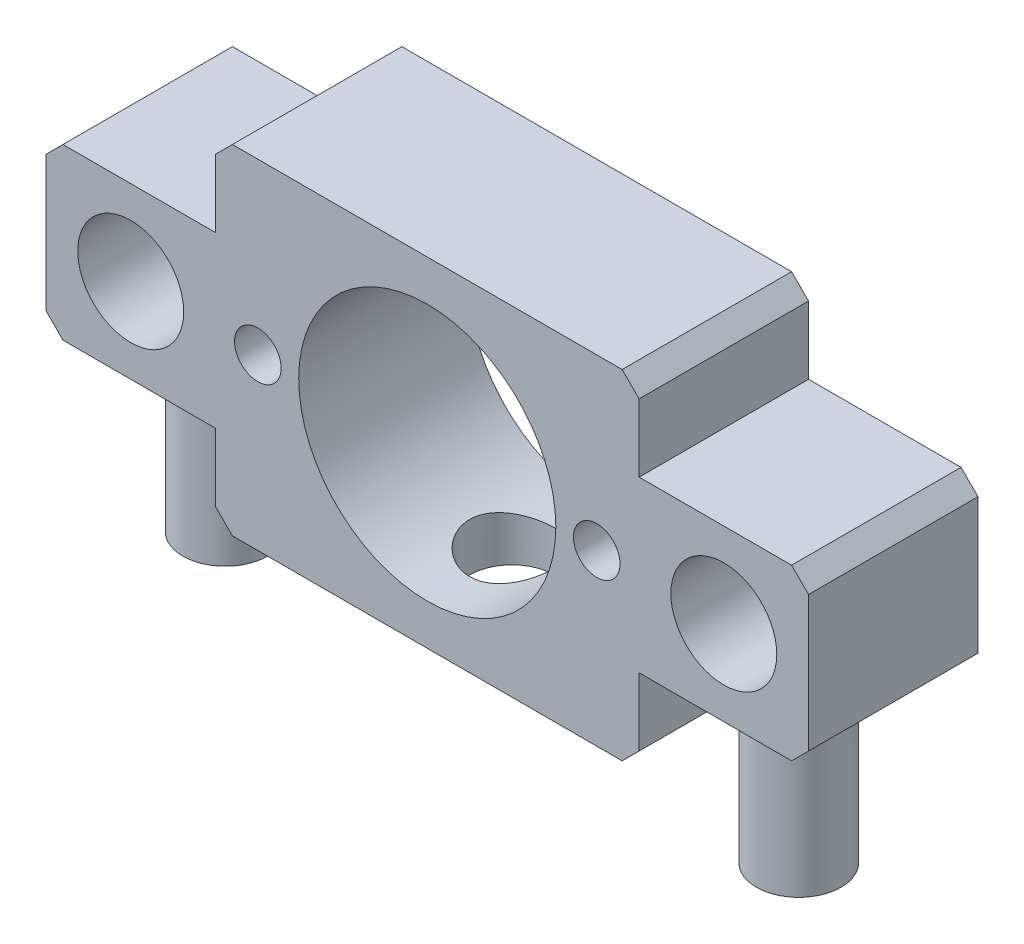
ISO-10303-21;
HEADER;
FILE_DESCRIPTION(('STEP AP214'),'2;1');
FILE_NAME('part.step','',(''),(''),'','','');
FILE_SCHEMA(('AUTOMOTIVE_DESIGN { 1 0 10303 214 1 1 1 1 }'));
ENDSEC;
DATA;
#1=APPLICATION_CONTEXT('core data for automotive mechanical design processes');
#2=APPLICATION_PROTOCOL_DEFINITION('international standard','automotive_design',2000,#1);
#3=PRODUCT_CONTEXT('',#1,'mechanical');
#4=PRODUCT('Part','Part','',(#3));
#5=PRODUCT_RELATED_PRODUCT_CATEGORY('part','',(#4));
#6=PRODUCT_DEFINITION_FORMATION('','',#4);
#7=PRODUCT_DEFINITION_CONTEXT('part definition',#1,'design');
#8=PRODUCT_DEFINITION('design','',#6,#7);
#9=PRODUCT_DEFINITION_SHAPE('','',#8);
#10=(LENGTH_UNIT() NAMED_UNIT(*) SI_UNIT(.MILLI.,.METRE.));
#11=(NAMED_UNIT(*) PLANE_ANGLE_UNIT() SI_UNIT($,.RADIAN.));
#12=(NAMED_UNIT(*) SI_UNIT($,.STERADIAN.) SOLID_ANGLE_UNIT());
#13=UNCERTAINTY_MEASURE_WITH_UNIT(LENGTH_MEASURE(1.E-05),#10,'distance_accuracy_value','');
#14=(GEOMETRIC_REPRESENTATION_CONTEXT(3) GLOBAL_UNCERTAINTY_ASSIGNED_CONTEXT((#13)) GLOBAL_UNIT_ASSIGNED_CONTEXT((#10,
#11,#12)) REPRESENTATION_CONTEXT('',''));
#15=CARTESIAN_POINT('',(0.,0.,0.));
#16=DIRECTION('',(0.,0.,1.));
#17=DIRECTION('',(1.,0.,0.));
#18=AXIS2_PLACEMENT_3D('',#15,#16,#17);
#19=CARTESIAN_POINT('',(0.,0.,10.));
#20=DIRECTION('',(0.,0.,1.));
#21=DIRECTION('',(1.,0.,0.));
#22=AXIS2_PLACEMENT_3D('',#19,#20,#21);
#23=PLANE('',#22);
#24=CARTESIAN_POINT('',(-20.,0.,10.));
#25=DIRECTION('',(0.,0.,1.));
#26=DIRECTION('',(1.,0.,0.));
#27=AXIS2_PLACEMENT_3D('',#24,#25,#26);
#28=CIRCLE('',#27,2.75);
#29=CARTESIAN_POINT('',(-17.25,0.,10.));
#30=VERTEX_POINT('',#29);
#31=EDGE_CURVE('E638',#30,#30,#28,.T.);
#32=ORIENTED_EDGE('',*,*,#31,.F.);
#33=EDGE_LOOP('',(#32));
#34=FACE_BOUND('',#33,.T.);
#35=CARTESIAN_POINT('',(20.,0.,10.));
#36=DIRECTION('',(0.,0.,1.));
#37=DIRECTION('',(-1.,0.,0.));
#38=AXIS2_PLACEMENT_3D('',#35,#36,#37);
#39=CIRCLE('',#38,2.75);
#40=CARTESIAN_POINT('',(17.25,0.,10.));
#41=VERTEX_POINT('',#40);
#42=EDGE_CURVE('E644',#41,#41,#39,.T.);
#43=ORIENTED_EDGE('',*,*,#42,.F.);
#44=EDGE_LOOP('',(#43));
#45=FACE_BOUND('',#44,.T.);
#46=CARTESIAN_POINT('',(0.,0.,10.));
#47=DIRECTION('',(0.,0.,1.));
#48=DIRECTION('',(1.,0.,0.));
#49=AXIS2_PLACEMENT_3D('',#46,#47,#48);
#50=CIRCLE('',#49,15.175);
#51=CARTESIAN_POINT('',(15.175,0.,10.));
#52=VERTEX_POINT('',#51);
#53=EDGE_CURVE('E422',#52,#52,#50,.T.);
#54=ORIENTED_EDGE('',*,*,#53,.F.);
#55=EDGE_LOOP('',(#54));
#56=FACE_BOUND('',#55,.T.);
#57=CARTESIAN_POINT('',(-35.,0.,10.));
#58=DIRECTION('',(0.,0.,1.));
#59=DIRECTION('',(1.,0.,0.));
#60=AXIS2_PLACEMENT_3D('',#57,#58,#59);
#61=CIRCLE('',#60,6.25);
#62=CARTESIAN_POINT('',(-28.75,0.,10.));
#63=VERTEX_POINT('',#62);
#64=EDGE_CURVE('E409',#63,#63,#61,.T.);
#65=ORIENTED_EDGE('',*,*,#64,.F.);
#66=EDGE_LOOP('',(#65));
#67=FACE_BOUND('',#66,.T.);
#68=CARTESIAN_POINT('',(35.,0.,10.));
#69=DIRECTION('',(0.,0.,1.));
#70=DIRECTION('',(-1.,0.,0.));
#71=AXIS2_PLACEMENT_3D('',#68,#69,#70);
#72=CIRCLE('',#71,6.25);
#73=CARTESIAN_POINT('',(28.75,0.,10.));
#74=VERTEX_POINT('',#73);
#75=EDGE_CURVE('E612',#74,#74,#72,.T.);
#76=ORIENTED_EDGE('',*,*,#75,.F.);
#77=EDGE_LOOP('',(#76));
#78=FACE_BOUND('',#77,.T.);
#79=DIRECTION('',(-1.,0.,0.));
#80=VECTOR('',#79,1.);
#81=CARTESIAN_POINT('',(45.,20.,10.));
#82=LINE('',#81,#80);
#83=CARTESIAN_POINT('',(23.,20.,10.));
#84=VERTEX_POINT('',#83);
#85=CARTESIAN_POINT('',(-23.,20.,10.));
#86=VERTEX_POINT('',#85);
#87=EDGE_CURVE('E296',#84,#86,#82,.T.);
#88=ORIENTED_EDGE('',*,*,#87,.T.);
#89=DIRECTION('',(-0.707106781186549,-0.707106781186546,0.));
#90=VECTOR('',#89,1.);
#91=CARTESIAN_POINT('',(-21.5,21.5,10.));
#92=LINE('',#91,#90);
#93=CARTESIAN_POINT('',(-25.,18.,10.));
#94=VERTEX_POINT('',#93);
#95=EDGE_CURVE('E359',#86,#94,#92,.T.);
#96=ORIENTED_EDGE('',*,*,#95,.T.);
#97=DIRECTION('',(0.,-1.,0.));
#98=VECTOR('',#97,1.);
#99=CARTESIAN_POINT('',(-25.,20.,10.));
#100=LINE('',#99,#98);
#101=CARTESIAN_POINT('',(-25.,10.,10.));
#102=VERTEX_POINT('',#101);
#103=EDGE_CURVE('E259',#94,#102,#100,.T.);
#104=ORIENTED_EDGE('',*,*,#103,.T.);
#105=DIRECTION('',(-1.,0.,0.));
#106=VECTOR('',#105,1.);
#107=CARTESIAN_POINT('',(-25.,10.,10.));
#108=LINE('',#107,#106);
#109=CARTESIAN_POINT('',(-43.,10.,10.));
#110=VERTEX_POINT('',#109);
#111=EDGE_CURVE('E262',#102,#110,#108,.T.);
#112=ORIENTED_EDGE('',*,*,#111,.T.);
#113=DIRECTION('',(-0.70710678118655,-0.707106781186545,0.));
#114=VECTOR('',#113,1.);
#115=CARTESIAN_POINT('',(-26.4999999999999,26.5,10.));
#116=LINE('',#115,#114);
#117=CARTESIAN_POINT('',(-45.,8.00000000000001,10.));
#118=VERTEX_POINT('',#117);
#119=EDGE_CURVE('E340',#110,#118,#116,.T.);
#120=ORIENTED_EDGE('',*,*,#119,.T.);
#121=DIRECTION('',(0.,-1.,0.));
#122=VECTOR('',#121,1.);
#123=CARTESIAN_POINT('',(-45.,20.,10.));
#124=LINE('',#123,#122);
#125=CARTESIAN_POINT('',(-45.,-7.99999999999997,10.));
#126=VERTEX_POINT('',#125);
#127=EDGE_CURVE('E299',#118,#126,#124,.T.);
#128=ORIENTED_EDGE('',*,*,#127,.T.);
#129=DIRECTION('',(0.707106781186542,-0.707106781186553,0.));
#130=VECTOR('',#129,1.);
#131=CARTESIAN_POINT('',(-26.5000000000003,-26.4999999999999,10.));
#132=LINE('',#131,#130);
#133=CARTESIAN_POINT('',(-43.,-10.,10.));
#134=VERTEX_POINT('',#133);
#135=EDGE_CURVE('E345',#126,#134,#132,.T.);
#136=ORIENTED_EDGE('',*,*,#135,.T.);
#137=DIRECTION('',(1.,0.,0.));
#138=VECTOR('',#137,1.);
#139=CARTESIAN_POINT('',(-45.,-10.,10.));
#140=LINE('',#139,#138);
#141=CARTESIAN_POINT('',(-25.,-10.,10.));
#142=VERTEX_POINT('',#141);
#143=EDGE_CURVE('E241',#134,#142,#140,.T.);
#144=ORIENTED_EDGE('',*,*,#143,.T.);
#145=DIRECTION('',(0.,-1.,0.));
#146=VECTOR('',#145,1.);
#147=CARTESIAN_POINT('',(-25.,-10.,10.));
#148=LINE('',#147,#146);
#149=CARTESIAN_POINT('',(-25.,-18.,10.));
#150=VERTEX_POINT('',#149);
#151=EDGE_CURVE('E244',#142,#150,#148,.T.);
#152=ORIENTED_EDGE('',*,*,#151,.T.);
#153=DIRECTION('',(0.707106781186545,-0.70710678118655,0.));
#154=VECTOR('',#153,1.);
#155=CARTESIAN_POINT('',(-21.5000000000001,-21.4999999999999,10.));
#156=LINE('',#155,#154);
#157=CARTESIAN_POINT('',(-23.,-20.,10.));
#158=VERTEX_POINT('',#157);
#159=EDGE_CURVE('E353',#150,#158,#156,.T.);
#160=ORIENTED_EDGE('',*,*,#159,.T.);
#161=DIRECTION('',(1.,0.,0.));
#162=VECTOR('',#161,1.);
#163=CARTESIAN_POINT('',(-45.,-20.,10.));
#164=LINE('',#163,#162);
#165=CARTESIAN_POINT('',(23.,-20.,10.));
#166=VERTEX_POINT('',#165);
#167=EDGE_CURVE('E281',#158,#166,#164,.T.);
#168=ORIENTED_EDGE('',*,*,#167,.T.);
#169=DIRECTION('',(0.707106781186549,0.707106781186546,0.));
#170=VECTOR('',#169,1.);
#171=CARTESIAN_POINT('',(21.5,-21.5,10.));
#172=LINE('',#171,#170);
#173=CARTESIAN_POINT('',(25.,-18.,10.));
#174=VERTEX_POINT('',#173);
#175=EDGE_CURVE('E356',#166,#174,#172,.T.);
#176=ORIENTED_EDGE('',*,*,#175,.T.);
#177=DIRECTION('',(0.,1.,0.));
#178=VECTOR('',#177,1.);
#179=CARTESIAN_POINT('',(25.,-20.,10.));
#180=LINE('',#179,#178);
#181=CARTESIAN_POINT('',(25.,-10.,10.));
#182=VERTEX_POINT('',#181);
#183=EDGE_CURVE('E224',#174,#182,#180,.T.);
#184=ORIENTED_EDGE('',*,*,#183,.T.);
#185=DIRECTION('',(1.,0.,0.));
#186=VECTOR('',#185,1.);
#187=CARTESIAN_POINT('',(25.,-10.,10.));
#188=LINE('',#187,#186);
#189=CARTESIAN_POINT('',(43.,-10.,10.));
#190=VERTEX_POINT('',#189);
#191=EDGE_CURVE('E227',#182,#190,#188,.T.);
#192=ORIENTED_EDGE('',*,*,#191,.T.);
#193=DIRECTION('',(0.70710678118655,0.707106781186545,0.));
#194=VECTOR('',#193,1.);
#195=CARTESIAN_POINT('',(26.4999999999999,-26.5,10.));
#196=LINE('',#195,#194);
#197=CARTESIAN_POINT('',(45.,-8.00000000000001,10.));
#198=VERTEX_POINT('',#197);
#199=EDGE_CURVE('E71',#190,#198,#196,.T.);
#200=ORIENTED_EDGE('',*,*,#199,.T.);
#201=DIRECTION('',(0.,1.,0.));
#202=VECTOR('',#201,1.);
#203=CARTESIAN_POINT('',(45.,-20.,10.));
#204=LINE('',#203,#202);
#205=CARTESIAN_POINT('',(45.,7.99999999999997,10.));
#206=VERTEX_POINT('',#205);
#207=EDGE_CURVE('E276',#198,#206,#204,.T.);
#208=ORIENTED_EDGE('',*,*,#207,.T.);
#209=DIRECTION('',(-0.707106781186542,0.707106781186553,0.));
#210=VECTOR('',#209,1.);
#211=CARTESIAN_POINT('',(26.5000000000003,26.4999999999999,10.));
#212=LINE('',#211,#210);
#213=CARTESIAN_POINT('',(43.,10.,10.));
#214=VERTEX_POINT('',#213);
#215=EDGE_CURVE('E194',#206,#214,#212,.T.);
#216=ORIENTED_EDGE('',*,*,#215,.T.);
#217=DIRECTION('',(-1.,0.,0.));
#218=VECTOR('',#217,1.);
#219=CARTESIAN_POINT('',(45.,10.,10.));
#220=LINE('',#219,#218);
#221=CARTESIAN_POINT('',(25.,10.,10.));
#222=VERTEX_POINT('',#221);
#223=EDGE_CURVE('E187',#214,#222,#220,.T.);
#224=ORIENTED_EDGE('',*,*,#223,.T.);
#225=DIRECTION('',(0.,1.,0.));
#226=VECTOR('',#225,1.);
#227=CARTESIAN_POINT('',(25.,10.,10.));
#228=LINE('',#227,#226);
#229=CARTESIAN_POINT('',(25.,18.,10.));
#230=VERTEX_POINT('',#229);
#231=EDGE_CURVE('E191',#222,#230,#228,.T.);
#232=ORIENTED_EDGE('',*,*,#231,.T.);
#233=DIRECTION('',(-0.707106781186545,0.70710678118655,0.));
#234=VECTOR('',#233,1.);
#235=CARTESIAN_POINT('',(21.5000000000001,21.4999999999999,10.));
#236=LINE('',#235,#234);
#237=EDGE_CURVE('E348',#230,#84,#236,.T.);
#238=ORIENTED_EDGE('',*,*,#237,.T.);
#239=EDGE_LOOP('',(#88,#96,#104,#112,#120,#128,#136,#144,#152,#160,#168,#176,#184,#192,#200,
#208,#216,#224,#232,#238));
#240=FACE_BOUND('',#239,.T.);
#241=ADVANCED_FACE('F47',(#34,#45,#56,#67,#78,#240),#23,.T.);
#242=CARTESIAN_POINT('',(45.,-20.,-10.));
#243=DIRECTION('',(1.,0.,0.));
#244=DIRECTION('',(0.,0.,-1.));
#245=AXIS2_PLACEMENT_3D('',#242,#243,#244);
#246=PLANE('',#245);
#247=ORIENTED_EDGE('',*,*,#207,.F.);
#248=DIRECTION('',(0.,0.,-1.));
#249=VECTOR('',#248,1.);
#250=CARTESIAN_POINT('',(45.,-8.00000000000001,-10.));
#251=LINE('',#250,#249);
#252=CARTESIAN_POINT('',(45.,-8.00000000000001,-10.));
#253=VERTEX_POINT('',#252);
#254=EDGE_CURVE('E378',#198,#253,#251,.T.);
#255=ORIENTED_EDGE('',*,*,#254,.T.);
#256=DIRECTION('',(0.,1.,0.));
#257=VECTOR('',#256,1.);
#258=CARTESIAN_POINT('',(45.,-20.,-10.));
#259=LINE('',#258,#257);
#260=CARTESIAN_POINT('',(45.,7.99999999999997,-10.));
#261=VERTEX_POINT('',#260);
#262=EDGE_CURVE('E277',#253,#261,#259,.T.);
#263=ORIENTED_EDGE('',*,*,#262,.T.);
#264=DIRECTION('',(0.,0.,1.));
#265=VECTOR('',#264,1.);
#266=CARTESIAN_POINT('',(45.,7.99999999999997,10.));
#267=LINE('',#266,#265);
#268=EDGE_CURVE('E64',#261,#206,#267,.T.);
#269=ORIENTED_EDGE('',*,*,#268,.T.);
#270=EDGE_LOOP('',(#247,#255,#263,#269));
#271=FACE_BOUND('',#270,.T.);
#272=ADVANCED_FACE('F449',(#271),#246,.T.);
#273=CARTESIAN_POINT('',(-45.,-20.,-10.));
#274=DIRECTION('',(0.,-1.,0.));
#275=DIRECTION('',(1.,0.,0.));
#276=AXIS2_PLACEMENT_3D('',#273,#274,#275);
#277=PLANE('',#276);
#278=CARTESIAN_POINT('',(0.,-20.,0.));
#279=DIRECTION('',(0.,-1.,0.));
#280=DIRECTION('',(0.,0.,-1.));
#281=AXIS2_PLACEMENT_3D('',#278,#279,#280);
#282=CIRCLE('',#281,4.99999999999999);
#283=CARTESIAN_POINT('',(0.,-20.,-4.99999999999999));
#284=VERTEX_POINT('',#283);
#285=EDGE_CURVE('E221',#284,#284,#282,.T.);
#286=ORIENTED_EDGE('',*,*,#285,.F.);
#287=EDGE_LOOP('',(#286));
#288=FACE_BOUND('',#287,.T.);
#289=DIRECTION('',(1.,0.,0.));
#290=VECTOR('',#289,1.);
#291=CARTESIAN_POINT('',(-45.,-20.,-10.));
#292=LINE('',#291,#290);
#293=CARTESIAN_POINT('',(-23.,-20.,-10.));
#294=VERTEX_POINT('',#293);
#295=CARTESIAN_POINT('',(23.,-20.,-10.));
#296=VERTEX_POINT('',#295);
#297=EDGE_CURVE('E289',#294,#296,#292,.T.);
#298=ORIENTED_EDGE('',*,*,#297,.T.);
#299=DIRECTION('',(0.,0.,1.));
#300=VECTOR('',#299,1.);
#301=CARTESIAN_POINT('',(23.,-20.,10.));
#302=LINE('',#301,#300);
#303=EDGE_CURVE('E370',#296,#166,#302,.T.);
#304=ORIENTED_EDGE('',*,*,#303,.T.);
#305=ORIENTED_EDGE('',*,*,#167,.F.);
#306=DIRECTION('',(0.,0.,-1.));
#307=VECTOR('',#306,1.);
#308=CARTESIAN_POINT('',(-23.,-20.,-10.));
#309=LINE('',#308,#307);
#310=EDGE_CURVE('E366',#158,#294,#309,.T.);
#311=ORIENTED_EDGE('',*,*,#310,.T.);
#312=EDGE_LOOP('',(#298,#304,#305,#311));
#313=FACE_BOUND('',#312,.T.);
#314=ADVANCED_FACE('F456',(#288,#313),#277,.T.);
#315=CARTESIAN_POINT('',(-45.,20.,-10.));
#316=DIRECTION('',(-1.,0.,0.));
#317=DIRECTION('',(0.,0.,1.));
#318=AXIS2_PLACEMENT_3D('',#315,#316,#317);
#319=PLANE('',#318);
#320=DIRECTION('',(0.,-1.,0.));
#321=VECTOR('',#320,1.);
#322=CARTESIAN_POINT('',(-45.,20.,-10.));
#323=LINE('',#322,#321);
#324=CARTESIAN_POINT('',(-45.,8.00000000000001,-10.));
#325=VERTEX_POINT('',#324);
#326=CARTESIAN_POINT('',(-45.,-7.99999999999997,-10.));
#327=VERTEX_POINT('',#326);
#328=EDGE_CURVE('E285',#325,#327,#323,.T.);
#329=ORIENTED_EDGE('',*,*,#328,.T.);
#330=DIRECTION('',(0.,0.,1.));
#331=VECTOR('',#330,1.);
#332=CARTESIAN_POINT('',(-45.,-7.99999999999997,10.));
#333=LINE('',#332,#331);
#334=EDGE_CURVE('E395',#327,#126,#333,.T.);
#335=ORIENTED_EDGE('',*,*,#334,.T.);
#336=ORIENTED_EDGE('',*,*,#127,.F.);
#337=DIRECTION('',(0.,0.,-1.));
#338=VECTOR('',#337,1.);
#339=CARTESIAN_POINT('',(-45.,8.00000000000001,-10.));
#340=LINE('',#339,#338);
#341=EDGE_CURVE('E391',#118,#325,#340,.T.);
#342=ORIENTED_EDGE('',*,*,#341,.T.);
#343=EDGE_LOOP('',(#329,#335,#336,#342));
#344=FACE_BOUND('',#343,.T.);
#345=ADVANCED_FACE('F466',(#344),#319,.T.);
#346=CARTESIAN_POINT('',(45.,20.,-10.));
#347=DIRECTION('',(0.,1.,0.));
#348=DIRECTION('',(-1.,0.,0.));
#349=AXIS2_PLACEMENT_3D('',#346,#347,#348);
#350=PLANE('',#349);
#351=DIRECTION('',(-1.,0.,0.));
#352=VECTOR('',#351,1.);
#353=CARTESIAN_POINT('',(45.,20.,-10.));
#354=LINE('',#353,#352);
#355=CARTESIAN_POINT('',(23.,20.,-10.));
#356=VERTEX_POINT('',#355);
#357=CARTESIAN_POINT('',(-23.,20.,-10.));
#358=VERTEX_POINT('',#357);
#359=EDGE_CURVE('E280',#356,#358,#354,.T.);
#360=ORIENTED_EDGE('',*,*,#359,.T.);
#361=DIRECTION('',(0.,0.,1.));
#362=VECTOR('',#361,1.);
#363=CARTESIAN_POINT('',(-23.,20.,10.));
#364=LINE('',#363,#362);
#365=EDGE_CURVE('E337',#358,#86,#364,.T.);
#366=ORIENTED_EDGE('',*,*,#365,.T.);
#367=ORIENTED_EDGE('',*,*,#87,.F.);
#368=DIRECTION('',(0.,0.,-1.));
#369=VECTOR('',#368,1.);
#370=CARTESIAN_POINT('',(23.,20.,-10.));
#371=LINE('',#370,#369);
#372=EDGE_CURVE('E333',#84,#356,#371,.T.);
#373=ORIENTED_EDGE('',*,*,#372,.T.);
#374=EDGE_LOOP('',(#360,#366,#367,#373));
#375=FACE_BOUND('',#374,.T.);
#376=ADVANCED_FACE('F470',(#375),#350,.T.);
#377=CARTESIAN_POINT('',(0.,0.,-10.));
#378=DIRECTION('',(0.,0.,1.));
#379=DIRECTION('',(1.,0.,0.));
#380=AXIS2_PLACEMENT_3D('',#377,#378,#379);
#381=PLANE('',#380);
#382=CARTESIAN_POINT('',(0.,0.,-9.99999999999999));
#383=DIRECTION('',(0.,0.,1.));
#384=DIRECTION('',(1.,0.,0.));
#385=AXIS2_PLACEMENT_3D('',#382,#383,#384);
#386=CIRCLE('',#385,15.175);
#387=CARTESIAN_POINT('',(15.175,0.,-9.99999999999999));
#388=VERTEX_POINT('',#387);
#389=EDGE_CURVE('E421',#388,#388,#386,.T.);
#390=ORIENTED_EDGE('',*,*,#389,.T.);
#391=EDGE_LOOP('',(#390));
#392=FACE_BOUND('',#391,.T.);
#393=CARTESIAN_POINT('',(-35.,0.,-9.99999999999999));
#394=DIRECTION('',(0.,0.,1.));
#395=DIRECTION('',(1.,0.,0.));
#396=AXIS2_PLACEMENT_3D('',#393,#394,#395);
#397=CIRCLE('',#396,6.25);
#398=CARTESIAN_POINT('',(-28.75,0.,-9.99999999999999));
#399=VERTEX_POINT('',#398);
#400=EDGE_CURVE('E408',#399,#399,#397,.T.);
#401=ORIENTED_EDGE('',*,*,#400,.T.);
#402=EDGE_LOOP('',(#401));
#403=FACE_BOUND('',#402,.T.);
#404=CARTESIAN_POINT('',(35.,0.,-9.99999999999999));
#405=DIRECTION('',(0.,0.,1.));
#406=DIRECTION('',(1.,0.,0.));
#407=AXIS2_PLACEMENT_3D('',#404,#405,#406);
#408=CIRCLE('',#407,6.25);
#409=CARTESIAN_POINT('',(41.25,0.,-9.99999999999999));
#410=VERTEX_POINT('',#409);
#411=EDGE_CURVE('E404',#410,#410,#408,.T.);
#412=ORIENTED_EDGE('',*,*,#411,.T.);
#413=EDGE_LOOP('',(#412));
#414=FACE_BOUND('',#413,.T.);
#415=DIRECTION('',(0.,-1.,0.));
#416=VECTOR('',#415,1.);
#417=CARTESIAN_POINT('',(-25.,20.,-10.));
#418=LINE('',#417,#416);
#419=CARTESIAN_POINT('',(-25.,18.,-10.));
#420=VERTEX_POINT('',#419);
#421=CARTESIAN_POINT('',(-25.,10.,-10.));
#422=VERTEX_POINT('',#421);
#423=EDGE_CURVE('E258',#420,#422,#418,.T.);
#424=ORIENTED_EDGE('',*,*,#423,.F.);
#425=DIRECTION('',(0.707106781186549,0.707106781186546,0.));
#426=VECTOR('',#425,1.);
#427=CARTESIAN_POINT('',(-25.,18.,-10.));
#428=LINE('',#427,#426);
#429=EDGE_CURVE('E330',#420,#358,#428,.T.);
#430=ORIENTED_EDGE('',*,*,#429,.T.);
#431=ORIENTED_EDGE('',*,*,#359,.F.);
#432=DIRECTION('',(0.707106781186545,-0.70710678118655,0.));
#433=VECTOR('',#432,1.);
#434=CARTESIAN_POINT('',(23.,20.,-10.));
#435=LINE('',#434,#433);
#436=CARTESIAN_POINT('',(25.,18.,-10.));
#437=VERTEX_POINT('',#436);
#438=EDGE_CURVE('E318',#356,#437,#435,.T.);
#439=ORIENTED_EDGE('',*,*,#438,.T.);
#440=DIRECTION('',(0.,1.,0.));
#441=VECTOR('',#440,1.);
#442=CARTESIAN_POINT('',(25.,10.,-10.));
#443=LINE('',#442,#441);
#444=CARTESIAN_POINT('',(25.,10.,-10.));
#445=VERTEX_POINT('',#444);
#446=EDGE_CURVE('E199',#445,#437,#443,.T.);
#447=ORIENTED_EDGE('',*,*,#446,.F.);
#448=DIRECTION('',(-1.,0.,0.));
#449=VECTOR('',#448,1.);
#450=CARTESIAN_POINT('',(45.,10.,-10.));
#451=LINE('',#450,#449);
#452=CARTESIAN_POINT('',(43.,10.,-10.));
#453=VERTEX_POINT('',#452);
#454=EDGE_CURVE('E205',#453,#445,#451,.T.);
#455=ORIENTED_EDGE('',*,*,#454,.F.);
#456=DIRECTION('',(0.707106781186542,-0.707106781186553,0.));
#457=VECTOR('',#456,1.);
#458=CARTESIAN_POINT('',(43.,10.,-10.));
#459=LINE('',#458,#457);
#460=EDGE_CURVE('E312',#453,#261,#459,.T.);
#461=ORIENTED_EDGE('',*,*,#460,.T.);
#462=ORIENTED_EDGE('',*,*,#262,.F.);
#463=DIRECTION('',(-0.70710678118655,-0.707106781186545,0.));
#464=VECTOR('',#463,1.);
#465=CARTESIAN_POINT('',(45.,-8.00000000000001,-10.));
#466=LINE('',#465,#464);
#467=CARTESIAN_POINT('',(43.,-10.,-10.));
#468=VERTEX_POINT('',#467);
#469=EDGE_CURVE('E321',#253,#468,#466,.T.);
#470=ORIENTED_EDGE('',*,*,#469,.T.);
#471=DIRECTION('',(1.,0.,0.));
#472=VECTOR('',#471,1.);
#473=CARTESIAN_POINT('',(25.,-10.,-10.));
#474=LINE('',#473,#472);
#475=CARTESIAN_POINT('',(25.,-10.,-10.));
#476=VERTEX_POINT('',#475);
#477=EDGE_CURVE('E228',#476,#468,#474,.T.);
#478=ORIENTED_EDGE('',*,*,#477,.F.);
#479=DIRECTION('',(0.,1.,0.));
#480=VECTOR('',#479,1.);
#481=CARTESIAN_POINT('',(25.,-20.,-10.));
#482=LINE('',#481,#480);
#483=CARTESIAN_POINT('',(25.,-18.,-10.));
#484=VERTEX_POINT('',#483);
#485=EDGE_CURVE('E210',#484,#476,#482,.T.);
#486=ORIENTED_EDGE('',*,*,#485,.F.);
#487=DIRECTION('',(-0.707106781186549,-0.707106781186546,0.));
#488=VECTOR('',#487,1.);
#489=CARTESIAN_POINT('',(25.,-18.,-10.));
#490=LINE('',#489,#488);
#491=EDGE_CURVE('E327',#484,#296,#490,.T.);
#492=ORIENTED_EDGE('',*,*,#491,.T.);
#493=ORIENTED_EDGE('',*,*,#297,.F.);
#494=DIRECTION('',(-0.707106781186545,0.70710678118655,0.));
#495=VECTOR('',#494,1.);
#496=CARTESIAN_POINT('',(-23.,-20.,-10.));
#497=LINE('',#496,#495);
#498=CARTESIAN_POINT('',(-25.,-18.,-10.));
#499=VERTEX_POINT('',#498);
#500=EDGE_CURVE('E324',#294,#499,#497,.T.);
#501=ORIENTED_EDGE('',*,*,#500,.T.);
#502=DIRECTION('',(0.,-1.,0.));
#503=VECTOR('',#502,1.);
#504=CARTESIAN_POINT('',(-25.,-10.,-10.));
#505=LINE('',#504,#503);
#506=CARTESIAN_POINT('',(-25.,-10.,-10.));
#507=VERTEX_POINT('',#506);
#508=EDGE_CURVE('E245',#507,#499,#505,.T.);
#509=ORIENTED_EDGE('',*,*,#508,.F.);
#510=DIRECTION('',(1.,0.,0.));
#511=VECTOR('',#510,1.);
#512=CARTESIAN_POINT('',(-45.,-10.,-10.));
#513=LINE('',#512,#511);
#514=CARTESIAN_POINT('',(-43.,-10.,-10.));
#515=VERTEX_POINT('',#514);
#516=EDGE_CURVE('E240',#515,#507,#513,.T.);
#517=ORIENTED_EDGE('',*,*,#516,.F.);
#518=DIRECTION('',(-0.707106781186542,0.707106781186553,0.));
#519=VECTOR('',#518,1.);
#520=CARTESIAN_POINT('',(-43.,-10.,-10.));
#521=LINE('',#520,#519);
#522=EDGE_CURVE('E315',#515,#327,#521,.T.);
#523=ORIENTED_EDGE('',*,*,#522,.T.);
#524=ORIENTED_EDGE('',*,*,#328,.F.);
#525=DIRECTION('',(0.70710678118655,0.707106781186545,0.));
#526=VECTOR('',#525,1.);
#527=CARTESIAN_POINT('',(-45.,8.00000000000001,-10.));
#528=LINE('',#527,#526);
#529=CARTESIAN_POINT('',(-43.,10.,-10.));
#530=VERTEX_POINT('',#529);
#531=EDGE_CURVE('E309',#325,#530,#528,.T.);
#532=ORIENTED_EDGE('',*,*,#531,.T.);
#533=DIRECTION('',(-1.,0.,0.));
#534=VECTOR('',#533,1.);
#535=CARTESIAN_POINT('',(-25.,10.,-10.));
#536=LINE('',#535,#534);
#537=EDGE_CURVE('E263',#422,#530,#536,.T.);
#538=ORIENTED_EDGE('',*,*,#537,.F.);
#539=EDGE_LOOP('',(#424,#430,#431,#439,#447,#455,#461,#462,#470,#478,#486,#492,#493,#501,#509,
#517,#523,#524,#532,#538));
#540=FACE_BOUND('',#539,.T.);
#541=ADVANCED_FACE('F462',(#392,#403,#414,#540),#381,.F.);
#542=CARTESIAN_POINT('',(-25.,20.,10.));
#543=DIRECTION('',(1.,0.,0.));
#544=DIRECTION('',(0.,0.,-1.));
#545=AXIS2_PLACEMENT_3D('',#542,#543,#544);
#546=PLANE('',#545);
#547=ORIENTED_EDGE('',*,*,#103,.F.);
#548=DIRECTION('',(0.,0.,-1.));
#549=VECTOR('',#548,1.);
#550=CARTESIAN_POINT('',(-25.,18.,-10.));
#551=LINE('',#550,#549);
#552=EDGE_CURVE('E293',#94,#420,#551,.T.);
#553=ORIENTED_EDGE('',*,*,#552,.T.);
#554=ORIENTED_EDGE('',*,*,#423,.T.);
#555=DIRECTION('',(0.,0.,-1.));
#556=VECTOR('',#555,1.);
#557=CARTESIAN_POINT('',(-25.,10.,10.));
#558=LINE('',#557,#556);
#559=EDGE_CURVE('E267',#102,#422,#558,.T.);
#560=ORIENTED_EDGE('',*,*,#559,.F.);
#561=EDGE_LOOP('',(#547,#553,#554,#560));
#562=FACE_BOUND('',#561,.T.);
#563=ADVANCED_FACE('F535',(#562),#546,.F.);
#564=CARTESIAN_POINT('',(-25.,10.,10.));
#565=DIRECTION('',(0.,-1.,0.));
#566=DIRECTION('',(0.,0.,-1.));
#567=AXIS2_PLACEMENT_3D('',#564,#565,#566);
#568=PLANE('',#567);
#569=ORIENTED_EDGE('',*,*,#537,.T.);
#570=DIRECTION('',(0.,0.,1.));
#571=VECTOR('',#570,1.);
#572=CARTESIAN_POINT('',(-43.,10.,10.));
#573=LINE('',#572,#571);
#574=EDGE_CURVE('E401',#530,#110,#573,.T.);
#575=ORIENTED_EDGE('',*,*,#574,.T.);
#576=ORIENTED_EDGE('',*,*,#111,.F.);
#577=ORIENTED_EDGE('',*,*,#559,.T.);
#578=EDGE_LOOP('',(#569,#575,#576,#577));
#579=FACE_BOUND('',#578,.T.);
#580=ADVANCED_FACE('F539',(#579),#568,.F.);
#581=CARTESIAN_POINT('',(-45.,-10.,10.));
#582=DIRECTION('',(0.,1.,0.));
#583=DIRECTION('',(0.,0.,1.));
#584=AXIS2_PLACEMENT_3D('',#581,#582,#583);
#585=PLANE('',#584);
#586=CARTESIAN_POINT('',(-33.8463562108836,-10.,0.));
#587=DIRECTION('',(0.,1.,0.));
#588=DIRECTION('',(0.,0.,1.));
#589=AXIS2_PLACEMENT_3D('',#586,#587,#588);
#590=CIRCLE('',#589,5.);
#591=CARTESIAN_POINT('',(-33.8463562108836,-10.,5.));
#592=VERTEX_POINT('',#591);
#593=EDGE_CURVE('E57',#592,#592,#590,.F.);
#594=ORIENTED_EDGE('',*,*,#593,.F.);
#595=EDGE_LOOP('',(#594));
#596=FACE_BOUND('',#595,.T.);
#597=ORIENTED_EDGE('',*,*,#143,.F.);
#598=DIRECTION('',(0.,0.,-1.));
#599=VECTOR('',#598,1.);
#600=CARTESIAN_POINT('',(-43.,-10.,-10.));
#601=LINE('',#600,#599);
#602=EDGE_CURVE('E387',#134,#515,#601,.T.);
#603=ORIENTED_EDGE('',*,*,#602,.T.);
#604=ORIENTED_EDGE('',*,*,#516,.T.);
#605=DIRECTION('',(0.,0.,-1.));
#606=VECTOR('',#605,1.);
#607=CARTESIAN_POINT('',(-25.,-10.,10.));
#608=LINE('',#607,#606);
#609=EDGE_CURVE('E249',#142,#507,#608,.T.);
#610=ORIENTED_EDGE('',*,*,#609,.F.);
#611=EDGE_LOOP('',(#597,#603,#604,#610));
#612=FACE_BOUND('',#611,.T.);
#613=ADVANCED_FACE('F552',(#596,#612),#585,.F.);
#614=CARTESIAN_POINT('',(-25.,-10.,10.));
#615=DIRECTION('',(1.,0.,0.));
#616=DIRECTION('',(0.,1.,0.));
#617=AXIS2_PLACEMENT_3D('',#614,#615,#616);
#618=PLANE('',#617);
#619=ORIENTED_EDGE('',*,*,#508,.T.);
#620=DIRECTION('',(0.,0.,1.));
#621=VECTOR('',#620,1.);
#622=CARTESIAN_POINT('',(-25.,-18.,10.));
#623=LINE('',#622,#621);
#624=EDGE_CURVE('E373',#499,#150,#623,.T.);
#625=ORIENTED_EDGE('',*,*,#624,.T.);
#626=ORIENTED_EDGE('',*,*,#151,.F.);
#627=ORIENTED_EDGE('',*,*,#609,.T.);
#628=EDGE_LOOP('',(#619,#625,#626,#627));
#629=FACE_BOUND('',#628,.T.);
#630=ADVANCED_FACE('F577',(#629),#618,.F.);
#631=CARTESIAN_POINT('',(25.,-10.,10.));
#632=DIRECTION('',(0.,1.,0.));
#633=DIRECTION('',(0.,0.,1.));
#634=AXIS2_PLACEMENT_3D('',#631,#632,#633);
#635=PLANE('',#634);
#636=CARTESIAN_POINT('',(33.8463562108836,-10.,0.));
#637=DIRECTION('',(0.,1.,0.));
#638=DIRECTION('',(0.,0.,1.));
#639=AXIS2_PLACEMENT_3D('',#636,#637,#638);
#640=CIRCLE('',#639,5.);
#641=CARTESIAN_POINT('',(33.8463562108836,-10.,5.));
#642=VERTEX_POINT('',#641);
#643=EDGE_CURVE('E11',#642,#642,#640,.F.);
#644=ORIENTED_EDGE('',*,*,#643,.F.);
#645=EDGE_LOOP('',(#644));
#646=FACE_BOUND('',#645,.T.);
#647=ORIENTED_EDGE('',*,*,#477,.T.);
#648=DIRECTION('',(0.,0.,1.));
#649=VECTOR('',#648,1.);
#650=CARTESIAN_POINT('',(43.,-10.,10.));
#651=LINE('',#650,#649);
#652=EDGE_CURVE('E382',#468,#190,#651,.T.);
#653=ORIENTED_EDGE('',*,*,#652,.T.);
#654=ORIENTED_EDGE('',*,*,#191,.F.);
#655=DIRECTION('',(0.,0.,-1.));
#656=VECTOR('',#655,1.);
#657=CARTESIAN_POINT('',(25.,-10.,10.));
#658=LINE('',#657,#656);
#659=EDGE_CURVE('E231',#182,#476,#658,.T.);
#660=ORIENTED_EDGE('',*,*,#659,.T.);
#661=EDGE_LOOP('',(#647,#653,#654,#660));
#662=FACE_BOUND('',#661,.T.);
#663=ADVANCED_FACE('F573',(#646,#662),#635,.F.);
#664=CARTESIAN_POINT('',(25.,-20.,10.));
#665=DIRECTION('',(-1.,0.,0.));
#666=DIRECTION('',(0.,0.,1.));
#667=AXIS2_PLACEMENT_3D('',#664,#665,#666);
#668=PLANE('',#667);
#669=ORIENTED_EDGE('',*,*,#183,.F.);
#670=DIRECTION('',(0.,0.,-1.));
#671=VECTOR('',#670,1.);
#672=CARTESIAN_POINT('',(25.,-18.,-10.));
#673=LINE('',#672,#671);
#674=EDGE_CURVE('E362',#174,#484,#673,.T.);
#675=ORIENTED_EDGE('',*,*,#674,.T.);
#676=ORIENTED_EDGE('',*,*,#485,.T.);
#677=ORIENTED_EDGE('',*,*,#659,.F.);
#678=EDGE_LOOP('',(#669,#675,#676,#677));
#679=FACE_BOUND('',#678,.T.);
#680=ADVANCED_FACE('F569',(#679),#668,.F.);
#681=CARTESIAN_POINT('',(45.,10.,10.));
#682=DIRECTION('',(0.,-1.,0.));
#683=DIRECTION('',(0.,0.,-1.));
#684=AXIS2_PLACEMENT_3D('',#681,#682,#683);
#685=PLANE('',#684);
#686=ORIENTED_EDGE('',*,*,#223,.F.);
#687=DIRECTION('',(0.,0.,-1.));
#688=VECTOR('',#687,1.);
#689=CARTESIAN_POINT('',(43.,10.,-10.));
#690=LINE('',#689,#688);
#691=EDGE_CURVE('E398',#214,#453,#690,.T.);
#692=ORIENTED_EDGE('',*,*,#691,.T.);
#693=ORIENTED_EDGE('',*,*,#454,.T.);
#694=DIRECTION('',(0.,0.,-1.));
#695=VECTOR('',#694,1.);
#696=CARTESIAN_POINT('',(25.,10.,10.));
#697=LINE('',#696,#695);
#698=EDGE_CURVE('E202',#222,#445,#697,.T.);
#699=ORIENTED_EDGE('',*,*,#698,.F.);
#700=EDGE_LOOP('',(#686,#692,#693,#699));
#701=FACE_BOUND('',#700,.T.);
#702=ADVANCED_FACE('F203',(#701),#685,.F.);
#703=CARTESIAN_POINT('',(25.,10.,10.));
#704=DIRECTION('',(-1.,0.,0.));
#705=DIRECTION('',(0.,0.,1.));
#706=AXIS2_PLACEMENT_3D('',#703,#704,#705);
#707=PLANE('',#706);
#708=ORIENTED_EDGE('',*,*,#446,.T.);
#709=DIRECTION('',(0.,0.,1.));
#710=VECTOR('',#709,1.);
#711=CARTESIAN_POINT('',(25.,18.,10.));
#712=LINE('',#711,#710);
#713=EDGE_CURVE('E214',#437,#230,#712,.T.);
#714=ORIENTED_EDGE('',*,*,#713,.T.);
#715=ORIENTED_EDGE('',*,*,#231,.F.);
#716=ORIENTED_EDGE('',*,*,#698,.T.);
#717=EDGE_LOOP('',(#708,#714,#715,#716));
#718=FACE_BOUND('',#717,.T.);
#719=ADVANCED_FACE('F212',(#718),#707,.F.);
#720=CARTESIAN_POINT('',(0.,-20.,0.));
#721=DIRECTION('',(0.,-1.,0.));
#722=DIRECTION('',(0.,0.,-1.));
#723=AXIS2_PLACEMENT_3D('',#720,#721,#722);
#724=CYLINDRICAL_SURFACE('',#723,4.99999999999999);
#725=CARTESIAN_POINT('',(0.,-15.175,-4.99999999999999));
#726=CARTESIAN_POINT('',(-0.272994165064621,-15.1750003234133,-5.00000065470113));
#727=CARTESIAN_POINT('',(-0.545985687163569,-15.1675651309523,-4.9775693391335));
#728=CARTESIAN_POINT('',(-1.08393858702549,-15.1386363281503,-4.88870386133687));
#729=CARTESIAN_POINT('',(-1.34889894362756,-15.117140937839,-4.8222641277876));
#730=CARTESIAN_POINT('',(-1.86295601271752,-15.0624297631351,-4.64789890423872));
#731=CARTESIAN_POINT('',(-2.11207809207481,-15.0292333076492,-4.54004180517183));
#732=CARTESIAN_POINT('',(-2.58869767275593,-14.9545157448874,-4.28620922366985));
#733=CARTESIAN_POINT('',(-2.81619105224517,-14.9129930555297,-4.14022649532233));
#734=CARTESIAN_POINT('',(-3.25081498653006,-14.8244242025938,-3.80908199275436));
#735=CARTESIAN_POINT('',(-3.45710995210874,-14.7772479469122,-3.62285849878685));
#736=CARTESIAN_POINT('',(-3.83617661521526,-14.6834117721208,-3.2187766169279));
#737=CARTESIAN_POINT('',(-4.00894115497257,-14.6367519652582,-3.00091149178433));
#738=CARTESIAN_POINT('',(-4.32076715524423,-14.5478070278973,-2.53226281742849));
#739=CARTESIAN_POINT('',(-4.4587504324177,-14.5056808165573,-2.28072881261216));
#740=CARTESIAN_POINT('',(-4.69010115901474,-14.4325467464823,-1.7564130716162));
#741=CARTESIAN_POINT('',(-4.78348186768206,-14.4015355842023,-1.48363767805689));
#742=CARTESIAN_POINT('',(-4.91985658116749,-14.3555109479473,-0.934070737483525));
#743=CARTESIAN_POINT('',(-4.96441340619115,-14.3400027691743,-0.657709648062607));
#744=CARTESIAN_POINT('',(-5.00676056389049,-14.325275698506,-0.101032527167885));
#745=CARTESIAN_POINT('',(-5.00456495717839,-14.3260519091428,0.179282289893602));
#746=CARTESIAN_POINT('',(-4.95468468266707,-14.3433717883138,0.722658028651177));
#747=CARTESIAN_POINT('',(-4.90902937058868,-14.3592120097464,0.985931529786726));
#748=CARTESIAN_POINT('',(-4.77683241186795,-14.4037256274191,1.50084983088255));
#749=CARTESIAN_POINT('',(-4.69028597485201,-14.4324005272143,1.75249326459379));
#750=CARTESIAN_POINT('',(-4.47741552881681,-14.499860876896,2.24166088485103));
#751=CARTESIAN_POINT('',(-4.35048349455241,-14.5387991995913,2.47889848447337));
#752=CARTESIAN_POINT('',(-4.06086710187544,-14.6223338566173,2.92935272714785));
#753=CARTESIAN_POINT('',(-3.89817260793275,-14.6669317934362,3.14256253445667));
#754=CARTESIAN_POINT('',(-3.53186313522289,-14.7595384225491,3.5503256398266));
#755=CARTESIAN_POINT('',(-3.32658598431645,-14.8076051389752,3.74337555963092));
#756=CARTESIAN_POINT('',(-2.88597817089625,-14.899743221444,4.09269785872808));
#757=CARTESIAN_POINT('',(-2.65064475984734,-14.9438142214621,4.24896687082129));
#758=CARTESIAN_POINT('',(-2.1534713016313,-15.0235509086308,4.52146500958975));
#759=CARTESIAN_POINT('',(-1.89140071224889,-15.0591327813184,4.63729971650777));
#760=CARTESIAN_POINT('',(-1.35004204563951,-15.1172743765674,4.82277686311975));
#761=CARTESIAN_POINT('',(-1.07075984144553,-15.1398385141718,4.89243496508231));
#762=CARTESIAN_POINT('',(-0.515639302230228,-15.1686748305187,4.98093756435657));
#763=CARTESIAN_POINT('',(-0.240158334077322,-15.1755981492812,5.00181422160598));
#764=CARTESIAN_POINT('',(0.310420103876732,-15.1743205210659,4.9979389399833));
#765=CARTESIAN_POINT('',(0.585517629292681,-15.1661220610116,4.97319450394342));
#766=CARTESIAN_POINT('',(1.11944250079011,-15.1359515358612,4.8803920826708));
#767=CARTESIAN_POINT('',(1.37850988054787,-15.1143740913349,4.81357422852655));
#768=CARTESIAN_POINT('',(1.88165930245245,-15.0600156609226,4.64006511859135));
#769=CARTESIAN_POINT('',(2.12573943806888,-15.0272332531195,4.53336880203743));
#770=CARTESIAN_POINT('',(2.59904718930441,-14.9527422561606,4.28005500754402));
#771=CARTESIAN_POINT('',(2.82772460789656,-14.9108240007506,4.13247291292402));
#772=CARTESIAN_POINT('',(3.25773343684192,-14.8228219317226,3.80271457139836));
#773=CARTESIAN_POINT('',(3.45905663586333,-14.776736874176,3.62052797591606));
#774=CARTESIAN_POINT('',(3.83792739175137,-14.6830085417978,3.21717385128149));
#775=CARTESIAN_POINT('',(4.01402502465538,-14.6353867746088,2.99463614582177));
#776=CARTESIAN_POINT('',(4.32654697577224,-14.5460689586278,2.52214359471594));
#777=CARTESIAN_POINT('',(4.46297116922149,-14.504372928471,2.27218866285252));
#778=CARTESIAN_POINT('',(4.69159436487685,-14.4320475400726,1.75197964005754));
#779=CARTESIAN_POINT('',(4.78390033878787,-14.4013914587029,1.48177650518671));
#780=CARTESIAN_POINT('',(4.92130128998291,-14.3550262815708,0.928422949589782));
#781=CARTESIAN_POINT('',(4.96641689422452,-14.3393106555944,0.645278242170641));
#782=CARTESIAN_POINT('',(5.00657097021,-14.3253368549345,0.0893754092770483));
#783=CARTESIAN_POINT('',(5.0040105889031,-14.3262415827118,-0.183190203056654));
#784=CARTESIAN_POINT('',(4.95477351216799,-14.3433436816417,-0.723793385182929));
#785=CARTESIAN_POINT('',(4.90809932907523,-14.3595401819091,-0.991831211953629));
#786=CARTESIAN_POINT('',(4.77364241787689,-14.404784623088,-1.51094709357932));
#787=CARTESIAN_POINT('',(4.68662011149134,-14.4335943120455,-1.7622444890334));
#788=CARTESIAN_POINT('',(4.47454970976007,-14.5007359467596,-2.24686607599997));
#789=CARTESIAN_POINT('',(4.34949329845708,-14.539069974627,-2.48018632290655));
#790=CARTESIAN_POINT('',(4.05865578855728,-14.6229869410958,-2.93305263907691));
#791=CARTESIAN_POINT('',(3.89136065705455,-14.6688099244377,-3.15158165617899));
#792=CARTESIAN_POINT('',(3.52337377600317,-14.7615181957055,-3.55824049531763));
#793=CARTESIAN_POINT('',(3.32267268310488,-14.8084037776525,-3.74636178348639));
#794=CARTESIAN_POINT('',(2.88447025570627,-14.9000788321136,-4.09401330834005));
#795=CARTESIAN_POINT('',(2.64586578896605,-14.9447223786069,-4.2521962772826));
#796=CARTESIAN_POINT('',(2.14399675698093,-15.0249242139771,-4.52602773572866));
#797=CARTESIAN_POINT('',(1.88073918046681,-15.0604850670497,-4.64168823409506));
#798=CARTESIAN_POINT('',(1.35119675163588,-15.1169451619128,-4.82165234562418));
#799=CARTESIAN_POINT('',(1.08578816128665,-15.1385131662485,-4.88832279452295));
#800=CARTESIAN_POINT('',(0.546917415824019,-15.1675385816066,-4.97749052832624));
#801=CARTESIAN_POINT('',(0.27345738194078,-15.174999676038,-4.99999934418796));
#802=CARTESIAN_POINT('',(0.,-15.175,-4.99999999999999));
#803=B_SPLINE_CURVE_WITH_KNOTS('',3,(#725,#726,#727,#728,#729,#730,#731,#732,#733,#734,#735,
#736,#737,#738,#739,#740,#741,#742,#743,#744,#745,#746,#747,#748,#749,#750,#751,#752,#753,#754,
#755,#756,#757,#758,#759,#760,#761,#762,#763,#764,#765,#766,#767,#768,#769,#770,#771,#772,#773,
#774,#775,#776,#777,#778,#779,#780,#781,#782,#783,#784,#785,#786,#787,#788,#789,#790,#791,#792,
#793,#794,#795,#796,#797,#798,#799,#800,#801,#802),.UNSPECIFIED.,.T.,.F.,(4,2,2,2,2,2,2,2,2,2,2,
2,2,2,2,2,2,2,2,2,2,2,2,2,2,2,2,2,2,2,2,2,2,2,2,2,2,2,4),(0.,0.817976409777321,1.63605639246121,
2.45279127942172,3.26968150287471,4.11155596375026,4.95360994313932,5.81922298551169,
6.68457854206991,7.5213431076904,8.35785602317391,9.15713047885278,9.95649859233536,
10.7685214337757,11.5807747100922,12.4343993612852,13.2881021292999,14.1499138343547,
15.0114330787097,15.8363684261491,16.6611681170544,17.4627266977417,18.2643870345108,
19.0868623974814,19.9095841124695,20.7687833994125,21.6279853883054,22.4850934007076,
23.3418266135869,24.1555336105777,24.9691942687429,25.7681074007976,26.5671953367425,
27.4004868882972,28.2340118969166,29.0989999611133,29.9637435541698,30.7833219344434,
31.6026862877221),.UNSPECIFIED.);
#804=CARTESIAN_POINT('',(0.,-15.175,-4.99999999999999));
#805=VERTEX_POINT('',#804);
#806=EDGE_CURVE('E413',#805,#805,#803,.T.);
#807=ORIENTED_EDGE('',*,*,#806,.T.);
#808=EDGE_LOOP('',(#807));
#809=FACE_BOUND('',#808,.T.);
#810=ORIENTED_EDGE('',*,*,#285,.T.);
#811=EDGE_LOOP('',(#810));
#812=FACE_BOUND('',#811,.T.);
#813=ADVANCED_FACE('F423',(#809,#812),#724,.F.);
#814=CARTESIAN_POINT('',(-25.,18.,10.));
#815=DIRECTION('',(-0.707106781186546,0.707106781186549,0.));
#816=DIRECTION('',(0.,0.,1.));
#817=AXIS2_PLACEMENT_3D('',#814,#815,#816);
#818=PLANE('',#817);
#819=ORIENTED_EDGE('',*,*,#95,.F.);
#820=ORIENTED_EDGE('',*,*,#365,.F.);
#821=ORIENTED_EDGE('',*,*,#429,.F.);
#822=ORIENTED_EDGE('',*,*,#552,.F.);
#823=EDGE_LOOP('',(#819,#820,#821,#822));
#824=FACE_BOUND('',#823,.T.);
#825=ADVANCED_FACE('F476',(#824),#818,.T.);
#826=CARTESIAN_POINT('',(25.,-18.,10.));
#827=DIRECTION('',(0.707106781186546,-0.707106781186549,0.));
#828=DIRECTION('',(0.,0.,1.));
#829=AXIS2_PLACEMENT_3D('',#826,#827,#828);
#830=PLANE('',#829);
#831=ORIENTED_EDGE('',*,*,#175,.F.);
#832=ORIENTED_EDGE('',*,*,#303,.F.);
#833=ORIENTED_EDGE('',*,*,#491,.F.);
#834=ORIENTED_EDGE('',*,*,#674,.F.);
#835=EDGE_LOOP('',(#831,#832,#833,#834));
#836=FACE_BOUND('',#835,.T.);
#837=ADVANCED_FACE('F482',(#836),#830,.T.);
#838=CARTESIAN_POINT('',(-23.,-20.,-10.));
#839=DIRECTION('',(-0.70710678118655,-0.707106781186545,0.));
#840=DIRECTION('',(0.,0.,1.));
#841=AXIS2_PLACEMENT_3D('',#838,#839,#840);
#842=PLANE('',#841);
#843=ORIENTED_EDGE('',*,*,#159,.F.);
#844=ORIENTED_EDGE('',*,*,#624,.F.);
#845=ORIENTED_EDGE('',*,*,#500,.F.);
#846=ORIENTED_EDGE('',*,*,#310,.F.);
#847=EDGE_LOOP('',(#843,#844,#845,#846));
#848=FACE_BOUND('',#847,.T.);
#849=ADVANCED_FACE('F489',(#848),#842,.T.);
#850=CARTESIAN_POINT('',(45.,-8.00000000000001,-10.));
#851=DIRECTION('',(0.707106781186545,-0.70710678118655,0.));
#852=DIRECTION('',(0.,0.,1.));
#853=AXIS2_PLACEMENT_3D('',#850,#851,#852);
#854=PLANE('',#853);
#855=ORIENTED_EDGE('',*,*,#199,.F.);
#856=ORIENTED_EDGE('',*,*,#652,.F.);
#857=ORIENTED_EDGE('',*,*,#469,.F.);
#858=ORIENTED_EDGE('',*,*,#254,.F.);
#859=EDGE_LOOP('',(#855,#856,#857,#858));
#860=FACE_BOUND('',#859,.T.);
#861=ADVANCED_FACE('F496',(#860),#854,.T.);
#862=CARTESIAN_POINT('',(23.,20.,-10.));
#863=DIRECTION('',(0.70710678118655,0.707106781186545,0.));
#864=DIRECTION('',(0.,0.,1.));
#865=AXIS2_PLACEMENT_3D('',#862,#863,#864);
#866=PLANE('',#865);
#867=ORIENTED_EDGE('',*,*,#237,.F.);
#868=ORIENTED_EDGE('',*,*,#713,.F.);
#869=ORIENTED_EDGE('',*,*,#438,.F.);
#870=ORIENTED_EDGE('',*,*,#372,.F.);
#871=EDGE_LOOP('',(#867,#868,#869,#870));
#872=FACE_BOUND('',#871,.T.);
#873=ADVANCED_FACE('F503',(#872),#866,.T.);
#874=CARTESIAN_POINT('',(-43.,-10.,10.));
#875=DIRECTION('',(-0.707106781186553,-0.707106781186542,0.));
#876=DIRECTION('',(0.,0.,1.));
#877=AXIS2_PLACEMENT_3D('',#874,#875,#876);
#878=PLANE('',#877);
#879=ORIENTED_EDGE('',*,*,#135,.F.);
#880=ORIENTED_EDGE('',*,*,#334,.F.);
#881=ORIENTED_EDGE('',*,*,#522,.F.);
#882=ORIENTED_EDGE('',*,*,#602,.F.);
#883=EDGE_LOOP('',(#879,#880,#881,#882));
#884=FACE_BOUND('',#883,.T.);
#885=ADVANCED_FACE('F510',(#884),#878,.T.);
#886=CARTESIAN_POINT('',(43.,10.,10.));
#887=DIRECTION('',(0.707106781186553,0.707106781186542,0.));
#888=DIRECTION('',(0.,0.,1.));
#889=AXIS2_PLACEMENT_3D('',#886,#887,#888);
#890=PLANE('',#889);
#891=ORIENTED_EDGE('',*,*,#215,.F.);
#892=ORIENTED_EDGE('',*,*,#268,.F.);
#893=ORIENTED_EDGE('',*,*,#460,.F.);
#894=ORIENTED_EDGE('',*,*,#691,.F.);
#895=EDGE_LOOP('',(#891,#892,#893,#894));
#896=FACE_BOUND('',#895,.T.);
#897=ADVANCED_FACE('F444',(#896),#890,.T.);
#898=CARTESIAN_POINT('',(-45.,8.00000000000001,-10.));
#899=DIRECTION('',(-0.707106781186545,0.70710678118655,0.));
#900=DIRECTION('',(0.,0.,1.));
#901=AXIS2_PLACEMENT_3D('',#898,#899,#900);
#902=PLANE('',#901);
#903=ORIENTED_EDGE('',*,*,#119,.F.);
#904=ORIENTED_EDGE('',*,*,#574,.F.);
#905=ORIENTED_EDGE('',*,*,#531,.F.);
#906=ORIENTED_EDGE('',*,*,#341,.F.);
#907=EDGE_LOOP('',(#903,#904,#905,#906));
#908=FACE_BOUND('',#907,.T.);
#909=ADVANCED_FACE('F50',(#908),#902,.T.);
#910=CARTESIAN_POINT('',(35.,0.,-90.));
#911=DIRECTION('',(0.,0.,1.));
#912=DIRECTION('',(1.,0.,0.));
#913=AXIS2_PLACEMENT_3D('',#910,#911,#912);
#914=CYLINDRICAL_SURFACE('',#913,6.25);
#915=ORIENTED_EDGE('',*,*,#75,.T.);
#916=EDGE_LOOP('',(#915));
#917=FACE_BOUND('',#916,.T.);
#918=ORIENTED_EDGE('',*,*,#411,.F.);
#919=EDGE_LOOP('',(#918));
#920=FACE_BOUND('',#919,.T.);
#921=ADVANCED_FACE('F437',(#917,#920),#914,.F.);
#922=CARTESIAN_POINT('',(-35.,0.,-90.));
#923=DIRECTION('',(0.,0.,1.));
#924=DIRECTION('',(1.,0.,0.));
#925=AXIS2_PLACEMENT_3D('',#922,#923,#924);
#926=CYLINDRICAL_SURFACE('',#925,6.25);
#927=ORIENTED_EDGE('',*,*,#64,.T.);
#928=EDGE_LOOP('',(#927));
#929=FACE_BOUND('',#928,.T.);
#930=ORIENTED_EDGE('',*,*,#400,.F.);
#931=EDGE_LOOP('',(#930));
#932=FACE_BOUND('',#931,.T.);
#933=ADVANCED_FACE('F433',(#929,#932),#926,.F.);
#934=CARTESIAN_POINT('',(0.,0.,-90.));
#935=DIRECTION('',(0.,0.,1.));
#936=DIRECTION('',(1.,0.,0.));
#937=AXIS2_PLACEMENT_3D('',#934,#935,#936);
#938=CYLINDRICAL_SURFACE('',#937,15.175);
#939=ORIENTED_EDGE('',*,*,#806,.F.);
#940=EDGE_LOOP('',(#939));
#941=FACE_BOUND('',#940,.T.);
#942=ORIENTED_EDGE('',*,*,#53,.T.);
#943=EDGE_LOOP('',(#942));
#944=FACE_BOUND('',#943,.T.);
#945=ORIENTED_EDGE('',*,*,#389,.F.);
#946=EDGE_LOOP('',(#945));
#947=FACE_BOUND('',#946,.T.);
#948=ADVANCED_FACE('F427',(#941,#944,#947),#938,.F.);
#949=CARTESIAN_POINT('',(20.,0.,-2.));
#950=DIRECTION('',(0.,0.,1.));
#951=DIRECTION('',(1.,0.,0.));
#952=AXIS2_PLACEMENT_3D('',#949,#950,#951);
#953=CYLINDRICAL_SURFACE('',#952,2.75);
#954=CARTESIAN_POINT('',(20.,0.,-2.));
#955=DIRECTION('',(0.,0.,1.));
#956=DIRECTION('',(-1.,0.,0.));
#957=AXIS2_PLACEMENT_3D('',#954,#955,#956);
#958=CIRCLE('',#957,2.75);
#959=CARTESIAN_POINT('',(17.25,0.,-2.));
#960=VERTEX_POINT('',#959);
#961=EDGE_CURVE('E652',#960,#960,#958,.T.);
#962=ORIENTED_EDGE('',*,*,#961,.F.);
#963=EDGE_LOOP('',(#962));
#964=FACE_BOUND('',#963,.T.);
#965=ORIENTED_EDGE('',*,*,#42,.T.);
#966=EDGE_LOOP('',(#965));
#967=FACE_BOUND('',#966,.T.);
#968=ADVANCED_FACE('F432',(#964,#967),#953,.F.);
#969=CARTESIAN_POINT('',(-20.,0.,-2.));
#970=DIRECTION('',(0.,0.,1.));
#971=DIRECTION('',(1.,0.,0.));
#972=AXIS2_PLACEMENT_3D('',#969,#970,#971);
#973=CYLINDRICAL_SURFACE('',#972,2.75);
#974=CARTESIAN_POINT('',(-20.,0.,-2.));
#975=DIRECTION('',(0.,0.,1.));
#976=DIRECTION('',(1.,0.,0.));
#977=AXIS2_PLACEMENT_3D('',#974,#975,#976);
#978=CIRCLE('',#977,2.75);
#979=CARTESIAN_POINT('',(-17.25,0.,-2.));
#980=VERTEX_POINT('',#979);
#981=EDGE_CURVE('E635',#980,#980,#978,.T.);
#982=ORIENTED_EDGE('',*,*,#981,.F.);
#983=EDGE_LOOP('',(#982));
#984=FACE_BOUND('',#983,.T.);
#985=ORIENTED_EDGE('',*,*,#31,.T.);
#986=EDGE_LOOP('',(#985));
#987=FACE_BOUND('',#986,.T.);
#988=ADVANCED_FACE('F683',(#984,#987),#973,.F.);
#989=CARTESIAN_POINT('',(20.,0.,-1.99999999999999));
#990=DIRECTION('',(0.,0.,-1.));
#991=DIRECTION('',(-1.,0.,0.));
#992=AXIS2_PLACEMENT_3D('',#989,#990,#991);
#993=PLANE('',#992);
#994=ORIENTED_EDGE('',*,*,#961,.T.);
#995=EDGE_LOOP('',(#994));
#996=FACE_BOUND('',#995,.T.);
#997=ADVANCED_FACE('F685',(#996),#993,.F.);
#998=CARTESIAN_POINT('',(-20.,0.,-1.99999999999999));
#999=DIRECTION('',(0.,0.,-1.));
#1000=DIRECTION('',(-1.,0.,0.));
#1001=AXIS2_PLACEMENT_3D('',#998,#999,#1000);
#1002=PLANE('',#1001);
#1003=ORIENTED_EDGE('',*,*,#981,.T.);
#1004=EDGE_LOOP('',(#1003));
#1005=FACE_BOUND('',#1004,.T.);
#1006=ADVANCED_FACE('F681',(#1005),#1002,.F.);
#1007=CARTESIAN_POINT('',(-33.8463562108836,-30.,0.));
#1008=DIRECTION('',(0.,1.,0.));
#1009=DIRECTION('',(0.,0.,1.));
#1010=AXIS2_PLACEMENT_3D('',#1007,#1008,#1009);
#1011=CYLINDRICAL_SURFACE('',#1010,5.);
#1012=CARTESIAN_POINT('',(-33.8463562108836,-30.,0.));
#1013=DIRECTION('',(0.,-1.,0.));
#1014=DIRECTION('',(0.,0.,-1.));
#1015=AXIS2_PLACEMENT_3D('',#1012,#1013,#1014);
#1016=CIRCLE('',#1015,5.);
#1017=CARTESIAN_POINT('',(-33.8463562108836,-30.,-5.));
#1018=VERTEX_POINT('',#1017);
#1019=EDGE_CURVE('E647',#1018,#1018,#1016,.T.);
#1020=ORIENTED_EDGE('',*,*,#1019,.F.);
#1021=EDGE_LOOP('',(#1020));
#1022=FACE_BOUND('',#1021,.T.);
#1023=ORIENTED_EDGE('',*,*,#593,.T.);
#1024=EDGE_LOOP('',(#1023));
#1025=FACE_BOUND('',#1024,.T.);
#1026=ADVANCED_FACE('F678',(#1022,#1025),#1011,.T.);
#1027=CARTESIAN_POINT('',(-33.8463562108836,-30.,0.));
#1028=DIRECTION('',(0.,-1.,0.));
#1029=DIRECTION('',(0.,0.,-1.));
#1030=AXIS2_PLACEMENT_3D('',#1027,#1028,#1029);
#1031=PLANE('',#1030);
#1032=ORIENTED_EDGE('',*,*,#1019,.T.);
#1033=EDGE_LOOP('',(#1032));
#1034=FACE_BOUND('',#1033,.T.);
#1035=ADVANCED_FACE('F671',(#1034),#1031,.T.);
#1036=CARTESIAN_POINT('',(33.8463562108836,-30.,0.));
#1037=DIRECTION('',(0.,1.,0.));
#1038=DIRECTION('',(0.,0.,1.));
#1039=AXIS2_PLACEMENT_3D('',#1036,#1037,#1038);
#1040=CYLINDRICAL_SURFACE('',#1039,5.);
#1041=CARTESIAN_POINT('',(33.8463562108836,-30.,0.));
#1042=DIRECTION('',(0.,-1.,0.));
#1043=DIRECTION('',(0.,0.,-1.));
#1044=AXIS2_PLACEMENT_3D('',#1041,#1042,#1043);
#1045=CIRCLE('',#1044,5.);
#1046=CARTESIAN_POINT('',(33.8463562108836,-30.,-5.));
#1047=VERTEX_POINT('',#1046);
#1048=EDGE_CURVE('E659',#1047,#1047,#1045,.T.);
#1049=ORIENTED_EDGE('',*,*,#1048,.F.);
#1050=EDGE_LOOP('',(#1049));
#1051=FACE_BOUND('',#1050,.T.);
#1052=ORIENTED_EDGE('',*,*,#643,.T.);
#1053=EDGE_LOOP('',(#1052));
#1054=FACE_BOUND('',#1053,.T.);
#1055=ADVANCED_FACE('F668',(#1051,#1054),#1040,.T.);
#1056=CARTESIAN_POINT('',(33.8463562108836,-30.,0.));
#1057=DIRECTION('',(0.,-1.,0.));
#1058=DIRECTION('',(0.,0.,-1.));
#1059=AXIS2_PLACEMENT_3D('',#1056,#1057,#1058);
#1060=PLANE('',#1059);
#1061=ORIENTED_EDGE('',*,*,#1048,.T.);
#1062=EDGE_LOOP('',(#1061));
#1063=FACE_BOUND('',#1062,.T.);
#1064=ADVANCED_FACE('F666',(#1063),#1060,.T.);
#1065=CLOSED_SHELL('',(#241,#272,#314,#345,#376,#541,#563,#580,#613,#630,#663,#680,#702,#719,
#813,#825,#837,#849,#861,#873,#885,#897,#909,#921,#933,#948,#968,#988,#997,#1006,#1026,#1035,
#1055,#1064));
#1066=MANIFOLD_SOLID_BREP('B2',#1065);
#1067=ADVANCED_BREP_SHAPE_REPRESENTATION('',(#18,#1066),#14);
#1068=SHAPE_DEFINITION_REPRESENTATION(#9,#1067);
ENDSEC;
END-ISO-10303-21;
